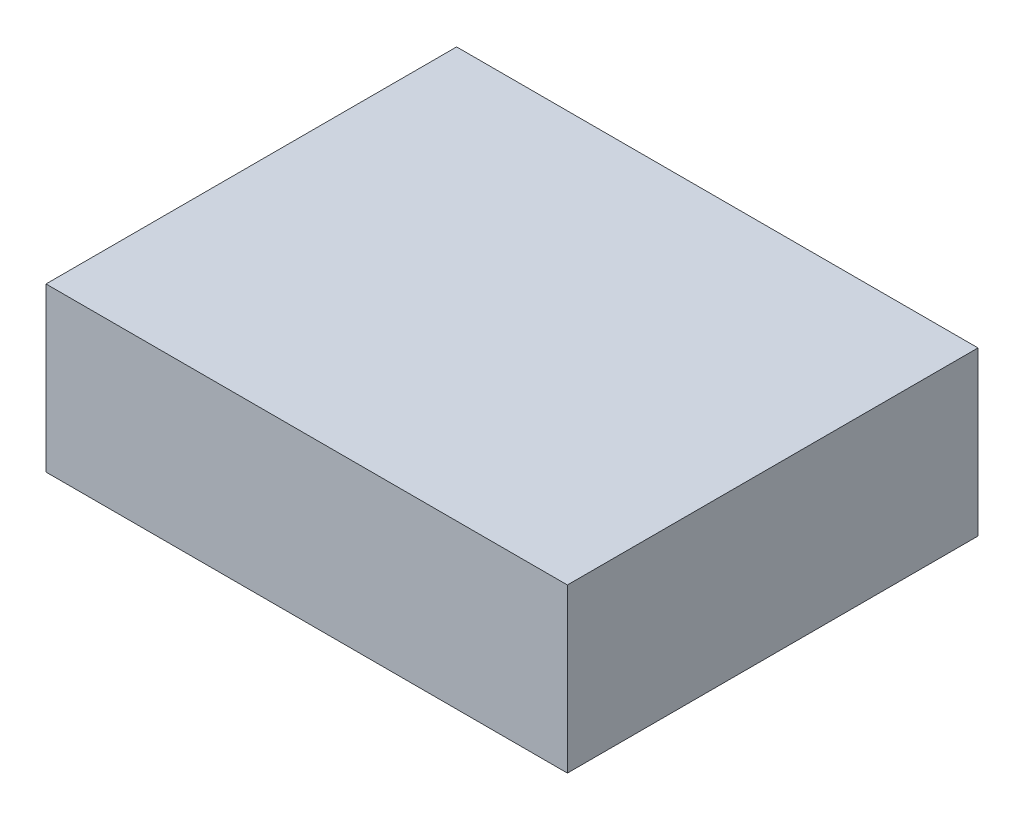
ISO-10303-21;
HEADER;
FILE_DESCRIPTION(('STEP AP214'),'2;1');
FILE_NAME('part.step','',(''),(''),'','','');
FILE_SCHEMA(('AUTOMOTIVE_DESIGN { 1 0 10303 214 1 1 1 1 }'));
ENDSEC;
DATA;
#1=APPLICATION_CONTEXT('core data for automotive mechanical design processes');
#2=APPLICATION_PROTOCOL_DEFINITION('international standard','automotive_design',2000,#1);
#3=PRODUCT_CONTEXT('',#1,'mechanical');
#4=PRODUCT('Part','Part','',(#3));
#5=PRODUCT_RELATED_PRODUCT_CATEGORY('part','',(#4));
#6=PRODUCT_DEFINITION_FORMATION('','',#4);
#7=PRODUCT_DEFINITION_CONTEXT('part definition',#1,'design');
#8=PRODUCT_DEFINITION('design','',#6,#7);
#9=PRODUCT_DEFINITION_SHAPE('','',#8);
#10=(LENGTH_UNIT() NAMED_UNIT(*) SI_UNIT(.MILLI.,.METRE.));
#11=(NAMED_UNIT(*) PLANE_ANGLE_UNIT() SI_UNIT($,.RADIAN.));
#12=(NAMED_UNIT(*) SI_UNIT($,.STERADIAN.) SOLID_ANGLE_UNIT());
#13=UNCERTAINTY_MEASURE_WITH_UNIT(LENGTH_MEASURE(1.E-05),#10,'distance_accuracy_value','');
#14=(GEOMETRIC_REPRESENTATION_CONTEXT(3) GLOBAL_UNCERTAINTY_ASSIGNED_CONTEXT((#13)) GLOBAL_UNIT_ASSIGNED_CONTEXT((#10,
#11,#12)) REPRESENTATION_CONTEXT('',''));
#15=CARTESIAN_POINT('',(0.,0.,0.));
#16=DIRECTION('',(0.,0.,1.));
#17=DIRECTION('',(1.,0.,0.));
#18=AXIS2_PLACEMENT_3D('',#15,#16,#17);
#19=CARTESIAN_POINT('',(0.,25.,0.));
#20=DIRECTION('',(-1.,0.,0.));
#21=DIRECTION('',(0.,0.,1.));
#22=AXIS2_PLACEMENT_3D('',#19,#20,#21);
#23=PLANE('',#22);
#24=DIRECTION('',(0.,0.,-1.));
#25=VECTOR('',#24,1.);
#26=CARTESIAN_POINT('',(0.,0.,0.));
#27=LINE('',#26,#25);
#28=CARTESIAN_POINT('',(0.,0.,0.));
#29=VERTEX_POINT('',#28);
#30=CARTESIAN_POINT('',(0.,0.,-63.));
#31=VERTEX_POINT('',#30);
#32=EDGE_CURVE('E100',#29,#31,#27,.T.);
#33=ORIENTED_EDGE('',*,*,#32,.F.);
#34=DIRECTION('',(0.,-1.,0.));
#35=VECTOR('',#34,1.);
#36=CARTESIAN_POINT('',(0.,25.,0.));
#37=LINE('',#36,#35);
#38=CARTESIAN_POINT('',(0.,25.,0.));
#39=VERTEX_POINT('',#38);
#40=EDGE_CURVE('E11',#39,#29,#37,.T.);
#41=ORIENTED_EDGE('',*,*,#40,.F.);
#42=DIRECTION('',(0.,0.,-1.));
#43=VECTOR('',#42,1.);
#44=CARTESIAN_POINT('',(0.,25.,0.));
#45=LINE('',#44,#43);
#46=CARTESIAN_POINT('',(0.,25.,-63.));
#47=VERTEX_POINT('',#46);
#48=EDGE_CURVE('E95',#39,#47,#45,.T.);
#49=ORIENTED_EDGE('',*,*,#48,.T.);
#50=DIRECTION('',(0.,-1.,0.));
#51=VECTOR('',#50,1.);
#52=CARTESIAN_POINT('',(0.,25.,-63.));
#53=LINE('',#52,#51);
#54=EDGE_CURVE('E38',#47,#31,#53,.T.);
#55=ORIENTED_EDGE('',*,*,#54,.T.);
#56=EDGE_LOOP('',(#33,#41,#49,#55));
#57=FACE_BOUND('',#56,.T.);
#58=ADVANCED_FACE('F35',(#57),#23,.T.);
#59=CARTESIAN_POINT('',(0.,25.,0.));
#60=DIRECTION('',(0.,0.,-1.));
#61=DIRECTION('',(-1.,0.,0.));
#62=AXIS2_PLACEMENT_3D('',#59,#60,#61);
#63=PLANE('',#62);
#64=DIRECTION('',(1.,0.,0.));
#65=VECTOR('',#64,1.);
#66=CARTESIAN_POINT('',(0.,0.,0.));
#67=LINE('',#66,#65);
#68=CARTESIAN_POINT('',(80.,0.,0.));
#69=VERTEX_POINT('',#68);
#70=EDGE_CURVE('E68',#29,#69,#67,.T.);
#71=ORIENTED_EDGE('',*,*,#70,.T.);
#72=DIRECTION('',(0.,-1.,0.));
#73=VECTOR('',#72,1.);
#74=CARTESIAN_POINT('',(80.,25.,0.));
#75=LINE('',#74,#73);
#76=CARTESIAN_POINT('',(80.,25.,0.));
#77=VERTEX_POINT('',#76);
#78=EDGE_CURVE('E44',#77,#69,#75,.T.);
#79=ORIENTED_EDGE('',*,*,#78,.F.);
#80=DIRECTION('',(1.,0.,0.));
#81=VECTOR('',#80,1.);
#82=CARTESIAN_POINT('',(0.,25.,0.));
#83=LINE('',#82,#81);
#84=EDGE_CURVE('E85',#39,#77,#83,.T.);
#85=ORIENTED_EDGE('',*,*,#84,.F.);
#86=ORIENTED_EDGE('',*,*,#40,.T.);
#87=EDGE_LOOP('',(#71,#79,#85,#86));
#88=FACE_BOUND('',#87,.T.);
#89=ADVANCED_FACE('F110',(#88),#63,.F.);
#90=CARTESIAN_POINT('',(80.,25.,0.));
#91=DIRECTION('',(-1.,0.,0.));
#92=DIRECTION('',(0.,0.,1.));
#93=AXIS2_PLACEMENT_3D('',#90,#91,#92);
#94=PLANE('',#93);
#95=DIRECTION('',(0.,0.,-1.));
#96=VECTOR('',#95,1.);
#97=CARTESIAN_POINT('',(80.,0.,0.));
#98=LINE('',#97,#96);
#99=CARTESIAN_POINT('',(80.,0.,-63.));
#100=VERTEX_POINT('',#99);
#101=EDGE_CURVE('E92',#69,#100,#98,.T.);
#102=ORIENTED_EDGE('',*,*,#101,.T.);
#103=DIRECTION('',(0.,-1.,0.));
#104=VECTOR('',#103,1.);
#105=CARTESIAN_POINT('',(80.,25.,-63.));
#106=LINE('',#105,#104);
#107=CARTESIAN_POINT('',(80.,25.,-63.));
#108=VERTEX_POINT('',#107);
#109=EDGE_CURVE('E89',#108,#100,#106,.T.);
#110=ORIENTED_EDGE('',*,*,#109,.F.);
#111=DIRECTION('',(0.,0.,-1.));
#112=VECTOR('',#111,1.);
#113=CARTESIAN_POINT('',(80.,25.,0.));
#114=LINE('',#113,#112);
#115=EDGE_CURVE('E80',#77,#108,#114,.T.);
#116=ORIENTED_EDGE('',*,*,#115,.F.);
#117=ORIENTED_EDGE('',*,*,#78,.T.);
#118=EDGE_LOOP('',(#102,#110,#116,#117));
#119=FACE_BOUND('',#118,.T.);
#120=ADVANCED_FACE('F90',(#119),#94,.F.);
#121=CARTESIAN_POINT('',(0.,25.,-63.));
#122=DIRECTION('',(0.,0.,-1.));
#123=DIRECTION('',(-1.,0.,0.));
#124=AXIS2_PLACEMENT_3D('',#121,#122,#123);
#125=PLANE('',#124);
#126=DIRECTION('',(1.,0.,0.));
#127=VECTOR('',#126,1.);
#128=CARTESIAN_POINT('',(0.,0.,-63.));
#129=LINE('',#128,#127);
#130=EDGE_CURVE('E103',#31,#100,#129,.T.);
#131=ORIENTED_EDGE('',*,*,#130,.F.);
#132=ORIENTED_EDGE('',*,*,#54,.F.);
#133=DIRECTION('',(1.,0.,0.));
#134=VECTOR('',#133,1.);
#135=CARTESIAN_POINT('',(0.,25.,-63.));
#136=LINE('',#135,#134);
#137=EDGE_CURVE('E84',#47,#108,#136,.T.);
#138=ORIENTED_EDGE('',*,*,#137,.T.);
#139=ORIENTED_EDGE('',*,*,#109,.T.);
#140=EDGE_LOOP('',(#131,#132,#138,#139));
#141=FACE_BOUND('',#140,.T.);
#142=ADVANCED_FACE('F94',(#141),#125,.T.);
#143=CARTESIAN_POINT('',(0.,25.,0.));
#144=DIRECTION('',(0.,-1.,0.));
#145=DIRECTION('',(0.,0.,-1.));
#146=AXIS2_PLACEMENT_3D('',#143,#144,#145);
#147=PLANE('',#146);
#148=ORIENTED_EDGE('',*,*,#48,.F.);
#149=ORIENTED_EDGE('',*,*,#84,.T.);
#150=ORIENTED_EDGE('',*,*,#115,.T.);
#151=ORIENTED_EDGE('',*,*,#137,.F.);
#152=EDGE_LOOP('',(#148,#149,#150,#151));
#153=FACE_BOUND('',#152,.T.);
#154=ADVANCED_FACE('F83',(#153),#147,.F.);
#155=CARTESIAN_POINT('',(0.,0.,0.));
#156=DIRECTION('',(0.,-1.,0.));
#157=DIRECTION('',(0.,0.,-1.));
#158=AXIS2_PLACEMENT_3D('',#155,#156,#157);
#159=PLANE('',#158);
#160=ORIENTED_EDGE('',*,*,#32,.T.);
#161=ORIENTED_EDGE('',*,*,#130,.T.);
#162=ORIENTED_EDGE('',*,*,#101,.F.);
#163=ORIENTED_EDGE('',*,*,#70,.F.);
#164=EDGE_LOOP('',(#160,#161,#162,#163));
#165=FACE_BOUND('',#164,.T.);
#166=ADVANCED_FACE('F108',(#165),#159,.T.);
#167=CLOSED_SHELL('',(#58,#89,#120,#142,#154,#166));
#168=MANIFOLD_SOLID_BREP('B2',#167);
#169=ADVANCED_BREP_SHAPE_REPRESENTATION('',(#18,#168),#14);
#170=SHAPE_DEFINITION_REPRESENTATION(#9,#169);
ENDSEC;
END-ISO-10303-21;
